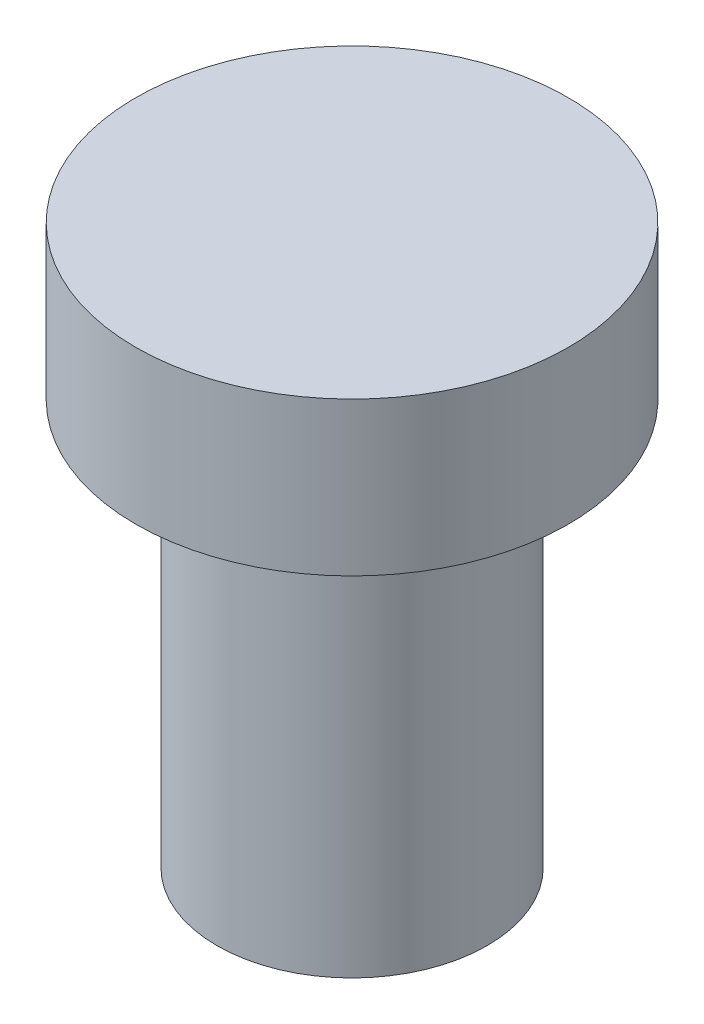
ISO-10303-21;
HEADER;
FILE_DESCRIPTION(('STEP AP214'),'2;1');
FILE_NAME('part.step','',(''),(''),'','','');
FILE_SCHEMA(('AUTOMOTIVE_DESIGN { 1 0 10303 214 1 1 1 1 }'));
ENDSEC;
DATA;
#1=APPLICATION_CONTEXT('core data for automotive mechanical design processes');
#2=APPLICATION_PROTOCOL_DEFINITION('international standard','automotive_design',2000,#1);
#3=PRODUCT_CONTEXT('',#1,'mechanical');
#4=PRODUCT('Part','Part','',(#3));
#5=PRODUCT_RELATED_PRODUCT_CATEGORY('part','',(#4));
#6=PRODUCT_DEFINITION_FORMATION('','',#4);
#7=PRODUCT_DEFINITION_CONTEXT('part definition',#1,'design');
#8=PRODUCT_DEFINITION('design','',#6,#7);
#9=PRODUCT_DEFINITION_SHAPE('','',#8);
#10=(LENGTH_UNIT() NAMED_UNIT(*) SI_UNIT(.MILLI.,.METRE.));
#11=(NAMED_UNIT(*) PLANE_ANGLE_UNIT() SI_UNIT($,.RADIAN.));
#12=(NAMED_UNIT(*) SI_UNIT($,.STERADIAN.) SOLID_ANGLE_UNIT());
#13=UNCERTAINTY_MEASURE_WITH_UNIT(LENGTH_MEASURE(1.E-05),#10,'distance_accuracy_value','');
#14=(GEOMETRIC_REPRESENTATION_CONTEXT(3) GLOBAL_UNCERTAINTY_ASSIGNED_CONTEXT((#13)) GLOBAL_UNIT_ASSIGNED_CONTEXT((#10,
#11,#12)) REPRESENTATION_CONTEXT('',''));
#15=CARTESIAN_POINT('',(0.,0.,0.));
#16=DIRECTION('',(0.,0.,1.));
#17=DIRECTION('',(1.,0.,0.));
#18=AXIS2_PLACEMENT_3D('',#15,#16,#17);
#19=CARTESIAN_POINT('',(0.,1.7,0.));
#20=DIRECTION('',(0.,-1.,0.));
#21=DIRECTION('',(0.,0.,-1.));
#22=AXIS2_PLACEMENT_3D('',#19,#20,#21);
#23=CYLINDRICAL_SURFACE('',#22,2.4);
#24=CARTESIAN_POINT('',(0.,1.7,0.));
#25=DIRECTION('',(0.,1.,0.));
#26=DIRECTION('',(0.,0.,1.));
#27=AXIS2_PLACEMENT_3D('',#24,#25,#26);
#28=CIRCLE('',#27,2.4);
#29=CARTESIAN_POINT('',(0.,1.7,2.4));
#30=VERTEX_POINT('',#29);
#31=EDGE_CURVE('E37',#30,#30,#28,.T.);
#32=ORIENTED_EDGE('',*,*,#31,.F.);
#33=EDGE_LOOP('',(#32));
#34=FACE_BOUND('',#33,.T.);
#35=CARTESIAN_POINT('',(0.,0.,0.));
#36=DIRECTION('',(0.,1.,0.));
#37=DIRECTION('',(0.,0.,1.));
#38=AXIS2_PLACEMENT_3D('',#35,#36,#37);
#39=CIRCLE('',#38,2.4);
#40=CARTESIAN_POINT('',(0.,0.,2.4));
#41=VERTEX_POINT('',#40);
#42=EDGE_CURVE('E33',#41,#41,#39,.T.);
#43=ORIENTED_EDGE('',*,*,#42,.T.);
#44=EDGE_LOOP('',(#43));
#45=FACE_BOUND('',#44,.T.);
#46=ADVANCED_FACE('F30',(#34,#45),#23,.T.);
#47=CARTESIAN_POINT('',(0.,1.7,0.));
#48=DIRECTION('',(0.,1.,0.));
#49=DIRECTION('',(0.,0.,1.));
#50=AXIS2_PLACEMENT_3D('',#47,#48,#49);
#51=PLANE('',#50);
#52=ORIENTED_EDGE('',*,*,#31,.T.);
#53=EDGE_LOOP('',(#52));
#54=FACE_BOUND('',#53,.T.);
#55=ADVANCED_FACE('F54',(#54),#51,.T.);
#56=CARTESIAN_POINT('',(0.,0.,0.));
#57=DIRECTION('',(0.,1.,0.));
#58=DIRECTION('',(0.,0.,1.));
#59=AXIS2_PLACEMENT_3D('',#56,#57,#58);
#60=PLANE('',#59);
#61=CARTESIAN_POINT('',(0.,0.,0.));
#62=DIRECTION('',(0.,-1.,0.));
#63=DIRECTION('',(0.,0.,-1.));
#64=AXIS2_PLACEMENT_3D('',#61,#62,#63);
#65=CIRCLE('',#64,1.5);
#66=CARTESIAN_POINT('',(0.,0.,-1.5));
#67=VERTEX_POINT('',#66);
#68=EDGE_CURVE('E10',#67,#67,#65,.T.);
#69=ORIENTED_EDGE('',*,*,#68,.F.);
#70=EDGE_LOOP('',(#69));
#71=FACE_BOUND('',#70,.T.);
#72=ORIENTED_EDGE('',*,*,#42,.F.);
#73=EDGE_LOOP('',(#72));
#74=FACE_BOUND('',#73,.T.);
#75=ADVANCED_FACE('F51',(#71,#74),#60,.F.);
#76=CARTESIAN_POINT('',(0.,-4.5,0.));
#77=DIRECTION('',(0.,1.,0.));
#78=DIRECTION('',(0.,0.,1.));
#79=AXIS2_PLACEMENT_3D('',#76,#77,#78);
#80=CYLINDRICAL_SURFACE('',#79,1.5);
#81=CARTESIAN_POINT('',(0.,-4.5,0.));
#82=DIRECTION('',(0.,-1.,0.));
#83=DIRECTION('',(0.,0.,-1.));
#84=AXIS2_PLACEMENT_3D('',#81,#82,#83);
#85=CIRCLE('',#84,1.5);
#86=CARTESIAN_POINT('',(0.,-4.5,-1.5));
#87=VERTEX_POINT('',#86);
#88=EDGE_CURVE('E43',#87,#87,#85,.T.);
#89=ORIENTED_EDGE('',*,*,#88,.F.);
#90=EDGE_LOOP('',(#89));
#91=FACE_BOUND('',#90,.T.);
#92=ORIENTED_EDGE('',*,*,#68,.T.);
#93=EDGE_LOOP('',(#92));
#94=FACE_BOUND('',#93,.T.);
#95=ADVANCED_FACE('F53',(#91,#94),#80,.T.);
#96=CARTESIAN_POINT('',(0.,-4.5,0.));
#97=DIRECTION('',(0.,-1.,0.));
#98=DIRECTION('',(0.,0.,-1.));
#99=AXIS2_PLACEMENT_3D('',#96,#97,#98);
#100=PLANE('',#99);
#101=ORIENTED_EDGE('',*,*,#88,.T.);
#102=EDGE_LOOP('',(#101));
#103=FACE_BOUND('',#102,.T.);
#104=ADVANCED_FACE('F60',(#103),#100,.T.);
#105=CLOSED_SHELL('',(#46,#55,#75,#95,#104));
#106=MANIFOLD_SOLID_BREP('B2',#105);
#107=ADVANCED_BREP_SHAPE_REPRESENTATION('',(#18,#106),#14);
#108=SHAPE_DEFINITION_REPRESENTATION(#9,#107);
ENDSEC;
END-ISO-10303-21;
